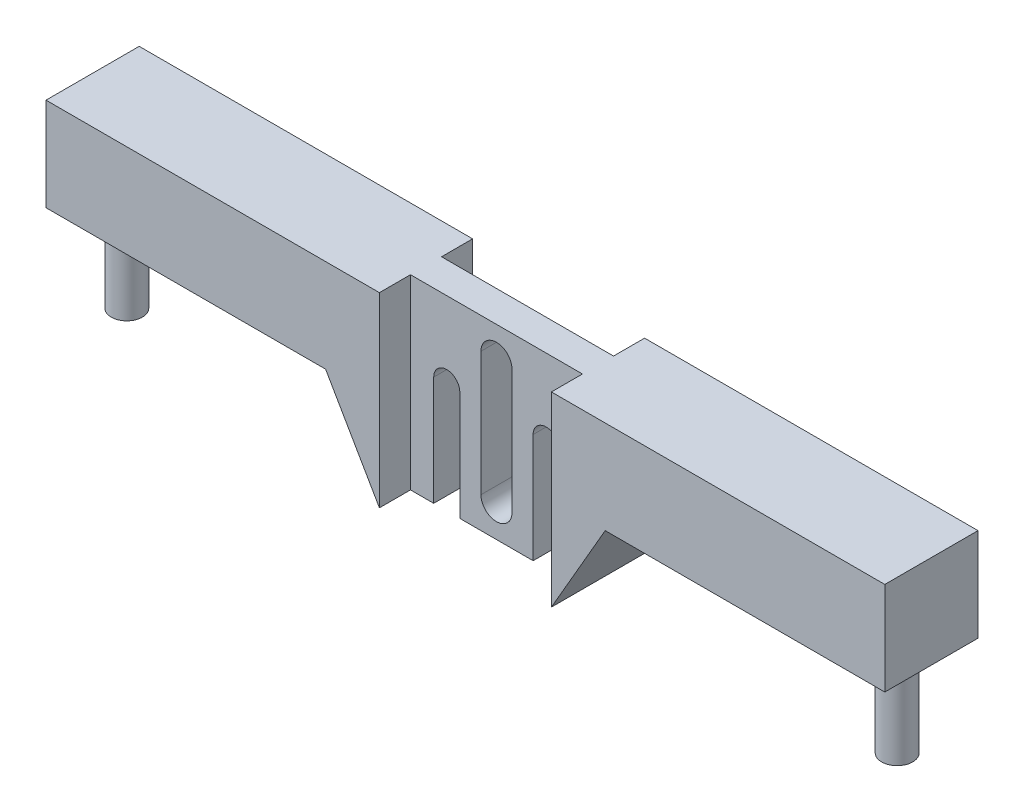
ISO-10303-21;
HEADER;
FILE_DESCRIPTION(('STEP AP214'),'2;1');
FILE_NAME('part.step','',(''),(''),'','','');
FILE_SCHEMA(('AUTOMOTIVE_DESIGN { 1 0 10303 214 1 1 1 1 }'));
ENDSEC;
DATA;
#1=APPLICATION_CONTEXT('core data for automotive mechanical design processes');
#2=APPLICATION_PROTOCOL_DEFINITION('international standard','automotive_design',2000,#1);
#3=PRODUCT_CONTEXT('',#1,'mechanical');
#4=PRODUCT('Part','Part','',(#3));
#5=PRODUCT_RELATED_PRODUCT_CATEGORY('part','',(#4));
#6=PRODUCT_DEFINITION_FORMATION('','',#4);
#7=PRODUCT_DEFINITION_CONTEXT('part definition',#1,'design');
#8=PRODUCT_DEFINITION('design','',#6,#7);
#9=PRODUCT_DEFINITION_SHAPE('','',#8);
#10=(LENGTH_UNIT() NAMED_UNIT(*) SI_UNIT(.MILLI.,.METRE.));
#11=(NAMED_UNIT(*) PLANE_ANGLE_UNIT() SI_UNIT($,.RADIAN.));
#12=(NAMED_UNIT(*) SI_UNIT($,.STERADIAN.) SOLID_ANGLE_UNIT());
#13=UNCERTAINTY_MEASURE_WITH_UNIT(LENGTH_MEASURE(1.E-05),#10,'distance_accuracy_value','');
#14=(GEOMETRIC_REPRESENTATION_CONTEXT(3) GLOBAL_UNCERTAINTY_ASSIGNED_CONTEXT((#13)) GLOBAL_UNIT_ASSIGNED_CONTEXT((#10,
#11,#12)) REPRESENTATION_CONTEXT('',''));
#15=CARTESIAN_POINT('',(0.,0.,0.));
#16=DIRECTION('',(0.,0.,1.));
#17=DIRECTION('',(1.,0.,0.));
#18=AXIS2_PLACEMENT_3D('',#15,#16,#17);
#19=CARTESIAN_POINT('',(0.,0.,7.5));
#20=DIRECTION('',(0.,0.,1.));
#21=DIRECTION('',(1.,0.,0.));
#22=AXIS2_PLACEMENT_3D('',#19,#20,#21);
#23=PLANE('',#22);
#24=DIRECTION('',(0.,-1.,0.));
#25=VECTOR('',#24,1.);
#26=CARTESIAN_POINT('',(13.8397459621557,7.501,7.5));
#27=LINE('',#26,#25);
#28=CARTESIAN_POINT('',(13.8397459621557,7.5,7.5));
#29=VERTEX_POINT('',#28);
#30=CARTESIAN_POINT('',(13.8397459621557,-22.5,7.5));
#31=VERTEX_POINT('',#30);
#32=EDGE_CURVE('E406',#29,#31,#27,.T.);
#33=ORIENTED_EDGE('',*,*,#32,.T.);
#34=DIRECTION('',(-0.499999999999998,-0.86602540378444,0.));
#35=VECTOR('',#34,1.);
#36=CARTESIAN_POINT('',(20.1225952641917,-11.6177857925749,7.5));
#37=LINE('',#36,#35);
#38=CARTESIAN_POINT('',(22.5,-7.5,7.5));
#39=VERTEX_POINT('',#38);
#40=EDGE_CURVE('E288',#39,#31,#37,.T.);
#41=ORIENTED_EDGE('',*,*,#40,.F.);
#42=DIRECTION('',(1.,0.,0.));
#43=VECTOR('',#42,1.);
#44=CARTESIAN_POINT('',(0.,-7.5,7.5));
#45=LINE('',#44,#43);
#46=CARTESIAN_POINT('',(67.5,-7.5,7.5));
#47=VERTEX_POINT('',#46);
#48=EDGE_CURVE('E285',#39,#47,#45,.T.);
#49=ORIENTED_EDGE('',*,*,#48,.T.);
#50=DIRECTION('',(0.,-1.,0.));
#51=VECTOR('',#50,1.);
#52=CARTESIAN_POINT('',(67.5,0.,7.5));
#53=LINE('',#52,#51);
#54=CARTESIAN_POINT('',(67.5,7.5,7.5));
#55=VERTEX_POINT('',#54);
#56=EDGE_CURVE('E272',#55,#47,#53,.T.);
#57=ORIENTED_EDGE('',*,*,#56,.F.);
#58=DIRECTION('',(1.,0.,0.));
#59=VECTOR('',#58,1.);
#60=CARTESIAN_POINT('',(0.,7.5,7.5));
#61=LINE('',#60,#59);
#62=EDGE_CURVE('E275',#29,#55,#61,.T.);
#63=ORIENTED_EDGE('',*,*,#62,.F.);
#64=EDGE_LOOP('',(#33,#41,#49,#57,#63));
#65=FACE_BOUND('',#64,.T.);
#66=ADVANCED_FACE('F36',(#65),#23,.T.);
#67=CARTESIAN_POINT('',(0.,0.,-7.5));
#68=DIRECTION('',(0.,0.,1.));
#69=DIRECTION('',(1.,0.,0.));
#70=AXIS2_PLACEMENT_3D('',#67,#68,#69);
#71=PLANE('',#70);
#72=DIRECTION('',(-0.499999999999998,-0.86602540378444,0.));
#73=VECTOR('',#72,1.);
#74=CARTESIAN_POINT('',(20.1225952641917,-11.6177857925749,-7.5));
#75=LINE('',#74,#73);
#76=CARTESIAN_POINT('',(22.5,-7.5,-7.5));
#77=VERTEX_POINT('',#76);
#78=CARTESIAN_POINT('',(13.8397459621557,-22.5,-7.5));
#79=VERTEX_POINT('',#78);
#80=EDGE_CURVE('E304',#77,#79,#75,.T.);
#81=ORIENTED_EDGE('',*,*,#80,.T.);
#82=DIRECTION('',(0.,-1.,0.));
#83=VECTOR('',#82,1.);
#84=CARTESIAN_POINT('',(13.8397459621557,7.501,-7.5));
#85=LINE('',#84,#83);
#86=CARTESIAN_POINT('',(13.8397459621557,7.5,-7.5));
#87=VERTEX_POINT('',#86);
#88=EDGE_CURVE('E348',#87,#79,#85,.T.);
#89=ORIENTED_EDGE('',*,*,#88,.F.);
#90=DIRECTION('',(1.,0.,0.));
#91=VECTOR('',#90,1.);
#92=CARTESIAN_POINT('',(0.,7.5,-7.5));
#93=LINE('',#92,#91);
#94=CARTESIAN_POINT('',(67.5,7.5,-7.5));
#95=VERTEX_POINT('',#94);
#96=EDGE_CURVE('E293',#87,#95,#93,.T.);
#97=ORIENTED_EDGE('',*,*,#96,.T.);
#98=DIRECTION('',(0.,-1.,0.));
#99=VECTOR('',#98,1.);
#100=CARTESIAN_POINT('',(67.5,0.,-7.5));
#101=LINE('',#100,#99);
#102=CARTESIAN_POINT('',(67.5,-7.5,-7.5));
#103=VERTEX_POINT('',#102);
#104=EDGE_CURVE('E263',#95,#103,#101,.T.);
#105=ORIENTED_EDGE('',*,*,#104,.T.);
#106=DIRECTION('',(1.,0.,0.));
#107=VECTOR('',#106,1.);
#108=CARTESIAN_POINT('',(0.,-7.5,-7.5));
#109=LINE('',#108,#107);
#110=EDGE_CURVE('E276',#77,#103,#109,.T.);
#111=ORIENTED_EDGE('',*,*,#110,.F.);
#112=EDGE_LOOP('',(#81,#89,#97,#105,#111));
#113=FACE_BOUND('',#112,.T.);
#114=ADVANCED_FACE('F446',(#113),#71,.F.);
#115=CARTESIAN_POINT('',(0.,-22.5,7.5));
#116=DIRECTION('',(0.,1.,0.));
#117=DIRECTION('',(0.,0.,1.));
#118=AXIS2_PLACEMENT_3D('',#115,#116,#117);
#119=PLANE('',#118);
#120=DIRECTION('',(0.,0.,-1.));
#121=VECTOR('',#120,1.);
#122=CARTESIAN_POINT('',(5.9,-22.5,-7.501));
#123=LINE('',#122,#121);
#124=CARTESIAN_POINT('',(5.9,-22.5,2.5));
#125=VERTEX_POINT('',#124);
#126=CARTESIAN_POINT('',(5.90000000000001,-22.5,-2.5));
#127=VERTEX_POINT('',#126);
#128=EDGE_CURVE('E227',#125,#127,#123,.T.);
#129=ORIENTED_EDGE('',*,*,#128,.F.);
#130=DIRECTION('',(1.,0.,0.));
#131=VECTOR('',#130,1.);
#132=CARTESIAN_POINT('',(-13.8397459621557,-22.5,2.5));
#133=LINE('',#132,#131);
#134=CARTESIAN_POINT('',(-5.89999999999999,-22.5,2.5));
#135=VERTEX_POINT('',#134);
#136=EDGE_CURVE('E208',#135,#125,#133,.T.);
#137=ORIENTED_EDGE('',*,*,#136,.F.);
#138=DIRECTION('',(0.,0.,1.));
#139=VECTOR('',#138,1.);
#140=CARTESIAN_POINT('',(-5.89999999999999,-22.5,-7.501));
#141=LINE('',#140,#139);
#142=CARTESIAN_POINT('',(-5.89999999999999,-22.5,-2.5));
#143=VERTEX_POINT('',#142);
#144=EDGE_CURVE('E255',#143,#135,#141,.T.);
#145=ORIENTED_EDGE('',*,*,#144,.F.);
#146=DIRECTION('',(-1.,0.,0.));
#147=VECTOR('',#146,1.);
#148=CARTESIAN_POINT('',(13.8397459621557,-22.5,-2.5));
#149=LINE('',#148,#147);
#150=EDGE_CURVE('E234',#127,#143,#149,.T.);
#151=ORIENTED_EDGE('',*,*,#150,.F.);
#152=EDGE_LOOP('',(#129,#137,#145,#151));
#153=FACE_BOUND('',#152,.T.);
#154=ADVANCED_FACE('F233',(#153),#119,.F.);
#155=DIRECTION('',(0.,0.,-1.));
#156=VECTOR('',#155,1.);
#157=CARTESIAN_POINT('',(13.8397459621557,-22.5,7.5));
#158=LINE('',#157,#156);
#159=CARTESIAN_POINT('',(13.8397459621557,-22.5,2.5));
#160=VERTEX_POINT('',#159);
#161=CARTESIAN_POINT('',(13.8397459621557,-22.5,-2.5));
#162=VERTEX_POINT('',#161);
#163=EDGE_CURVE('E311',#160,#162,#158,.T.);
#164=ORIENTED_EDGE('',*,*,#163,.F.);
#165=CARTESIAN_POINT('',(10.1,-22.5,2.5));
#166=VERTEX_POINT('',#165);
#167=EDGE_CURVE('E220',#166,#160,#133,.T.);
#168=ORIENTED_EDGE('',*,*,#167,.F.);
#169=DIRECTION('',(0.,0.,1.));
#170=VECTOR('',#169,1.);
#171=CARTESIAN_POINT('',(10.1,-22.5,-7.501));
#172=LINE('',#171,#170);
#173=CARTESIAN_POINT('',(10.1,-22.5,-2.5));
#174=VERTEX_POINT('',#173);
#175=EDGE_CURVE('E235',#174,#166,#172,.T.);
#176=ORIENTED_EDGE('',*,*,#175,.F.);
#177=EDGE_CURVE('E365',#162,#174,#149,.T.);
#178=ORIENTED_EDGE('',*,*,#177,.F.);
#179=EDGE_LOOP('',(#164,#168,#176,#178));
#180=FACE_BOUND('',#179,.T.);
#181=ADVANCED_FACE('F499',(#180),#119,.F.);
#182=CARTESIAN_POINT('',(67.5,0.,7.5));
#183=DIRECTION('',(1.,0.,0.));
#184=DIRECTION('',(0.,0.,-1.));
#185=AXIS2_PLACEMENT_3D('',#182,#183,#184);
#186=PLANE('',#185);
#187=ORIENTED_EDGE('',*,*,#104,.F.);
#188=DIRECTION('',(0.,0.,-1.));
#189=VECTOR('',#188,1.);
#190=CARTESIAN_POINT('',(67.5,7.5,7.5));
#191=LINE('',#190,#189);
#192=EDGE_CURVE('E11',#55,#95,#191,.T.);
#193=ORIENTED_EDGE('',*,*,#192,.F.);
#194=ORIENTED_EDGE('',*,*,#56,.T.);
#195=DIRECTION('',(0.,0.,-1.));
#196=VECTOR('',#195,1.);
#197=CARTESIAN_POINT('',(67.5,-7.5,7.5));
#198=LINE('',#197,#196);
#199=EDGE_CURVE('E307',#47,#103,#198,.T.);
#200=ORIENTED_EDGE('',*,*,#199,.T.);
#201=EDGE_LOOP('',(#187,#193,#194,#200));
#202=FACE_BOUND('',#201,.T.);
#203=ADVANCED_FACE('F38',(#202),#186,.T.);
#204=CARTESIAN_POINT('',(0.,7.5,7.5));
#205=DIRECTION('',(0.,1.,0.));
#206=DIRECTION('',(0.,0.,1.));
#207=AXIS2_PLACEMENT_3D('',#204,#205,#206);
#208=PLANE('',#207);
#209=DIRECTION('',(0.,0.,1.));
#210=VECTOR('',#209,1.);
#211=CARTESIAN_POINT('',(13.8397459621557,7.5,2.5));
#212=LINE('',#211,#210);
#213=CARTESIAN_POINT('',(13.8397459621557,7.5,2.5));
#214=VERTEX_POINT('',#213);
#215=EDGE_CURVE('E415',#214,#29,#212,.T.);
#216=ORIENTED_EDGE('',*,*,#215,.T.);
#217=ORIENTED_EDGE('',*,*,#62,.T.);
#218=ORIENTED_EDGE('',*,*,#192,.T.);
#219=ORIENTED_EDGE('',*,*,#96,.F.);
#220=DIRECTION('',(0.,0.,1.));
#221=VECTOR('',#220,1.);
#222=CARTESIAN_POINT('',(13.8397459621557,7.5,-7.5));
#223=LINE('',#222,#221);
#224=CARTESIAN_POINT('',(13.8397459621557,7.5,-2.5));
#225=VERTEX_POINT('',#224);
#226=EDGE_CURVE('E381',#87,#225,#223,.T.);
#227=ORIENTED_EDGE('',*,*,#226,.T.);
#228=DIRECTION('',(-1.,0.,0.));
#229=VECTOR('',#228,1.);
#230=CARTESIAN_POINT('',(13.8397459621557,7.5,-2.5));
#231=LINE('',#230,#229);
#232=CARTESIAN_POINT('',(-13.8397459621557,7.5,-2.5));
#233=VERTEX_POINT('',#232);
#234=EDGE_CURVE('E342',#225,#233,#231,.T.);
#235=ORIENTED_EDGE('',*,*,#234,.T.);
#236=DIRECTION('',(0.,0.,-1.));
#237=VECTOR('',#236,1.);
#238=CARTESIAN_POINT('',(-13.8397459621557,7.5,-2.5));
#239=LINE('',#238,#237);
#240=CARTESIAN_POINT('',(-13.8397459621557,7.5,-7.5));
#241=VERTEX_POINT('',#240);
#242=EDGE_CURVE('E244',#233,#241,#239,.T.);
#243=ORIENTED_EDGE('',*,*,#242,.T.);
#244=CARTESIAN_POINT('',(-67.5,7.5,-7.5));
#245=VERTEX_POINT('',#244);
#246=EDGE_CURVE('E294',#245,#241,#93,.T.);
#247=ORIENTED_EDGE('',*,*,#246,.F.);
#248=DIRECTION('',(0.,0.,-1.));
#249=VECTOR('',#248,1.);
#250=CARTESIAN_POINT('',(-67.5,7.5,7.5));
#251=LINE('',#250,#249);
#252=CARTESIAN_POINT('',(-67.5,7.5,7.5));
#253=VERTEX_POINT('',#252);
#254=EDGE_CURVE('E44',#253,#245,#251,.T.);
#255=ORIENTED_EDGE('',*,*,#254,.F.);
#256=CARTESIAN_POINT('',(-13.8397459621557,7.5,7.5));
#257=VERTEX_POINT('',#256);
#258=EDGE_CURVE('E277',#253,#257,#61,.T.);
#259=ORIENTED_EDGE('',*,*,#258,.T.);
#260=DIRECTION('',(0.,0.,-1.));
#261=VECTOR('',#260,1.);
#262=CARTESIAN_POINT('',(-13.8397459621557,7.5,7.5));
#263=LINE('',#262,#261);
#264=CARTESIAN_POINT('',(-13.8397459621557,7.5,2.5));
#265=VERTEX_POINT('',#264);
#266=EDGE_CURVE('E403',#257,#265,#263,.T.);
#267=ORIENTED_EDGE('',*,*,#266,.T.);
#268=DIRECTION('',(1.,0.,0.));
#269=VECTOR('',#268,1.);
#270=CARTESIAN_POINT('',(-13.8397459621557,7.5,2.5));
#271=LINE('',#270,#269);
#272=EDGE_CURVE('E417',#265,#214,#271,.T.);
#273=ORIENTED_EDGE('',*,*,#272,.T.);
#274=EDGE_LOOP('',(#216,#217,#218,#219,#227,#235,#243,#247,#255,#259,#267,#273));
#275=FACE_BOUND('',#274,.T.);
#276=ADVANCED_FACE('F339',(#275),#208,.T.);
#277=CARTESIAN_POINT('',(-67.5,0.,7.5));
#278=DIRECTION('',(1.,0.,0.));
#279=DIRECTION('',(0.,0.,-1.));
#280=AXIS2_PLACEMENT_3D('',#277,#278,#279);
#281=PLANE('',#280);
#282=DIRECTION('',(0.,-1.,0.));
#283=VECTOR('',#282,1.);
#284=CARTESIAN_POINT('',(-67.5,0.,-7.5));
#285=LINE('',#284,#283);
#286=CARTESIAN_POINT('',(-67.5,-7.5,-7.5));
#287=VERTEX_POINT('',#286);
#288=EDGE_CURVE('E297',#245,#287,#285,.T.);
#289=ORIENTED_EDGE('',*,*,#288,.T.);
#290=DIRECTION('',(0.,0.,-1.));
#291=VECTOR('',#290,1.);
#292=CARTESIAN_POINT('',(-67.5,-7.5,7.5));
#293=LINE('',#292,#291);
#294=CARTESIAN_POINT('',(-67.5,-7.5,7.5));
#295=VERTEX_POINT('',#294);
#296=EDGE_CURVE('E322',#295,#287,#293,.T.);
#297=ORIENTED_EDGE('',*,*,#296,.F.);
#298=DIRECTION('',(0.,-1.,0.));
#299=VECTOR('',#298,1.);
#300=CARTESIAN_POINT('',(-67.5,0.,7.5));
#301=LINE('',#300,#299);
#302=EDGE_CURVE('E280',#253,#295,#301,.T.);
#303=ORIENTED_EDGE('',*,*,#302,.F.);
#304=ORIENTED_EDGE('',*,*,#254,.T.);
#305=EDGE_LOOP('',(#289,#297,#303,#304));
#306=FACE_BOUND('',#305,.T.);
#307=ADVANCED_FACE('F327',(#306),#281,.F.);
#308=CARTESIAN_POINT('',(0.,-7.5,7.5));
#309=DIRECTION('',(0.,1.,0.));
#310=DIRECTION('',(0.,0.,1.));
#311=AXIS2_PLACEMENT_3D('',#308,#309,#310);
#312=PLANE('',#311);
#313=CARTESIAN_POINT('',(-61.994193156132,-7.5,0.));
#314=DIRECTION('',(0.,1.,0.));
#315=DIRECTION('',(0.,0.,1.));
#316=AXIS2_PLACEMENT_3D('',#313,#314,#315);
#317=CIRCLE('',#316,2.5);
#318=CARTESIAN_POINT('',(-61.994193156132,-7.5,2.50000000000001));
#319=VERTEX_POINT('',#318);
#320=EDGE_CURVE('E422',#319,#319,#317,.T.);
#321=ORIENTED_EDGE('',*,*,#320,.T.);
#322=EDGE_LOOP('',(#321));
#323=FACE_BOUND('',#322,.T.);
#324=CARTESIAN_POINT('',(-22.5,-7.5,-7.5));
#325=VERTEX_POINT('',#324);
#326=EDGE_CURVE('E299',#287,#325,#109,.T.);
#327=ORIENTED_EDGE('',*,*,#326,.T.);
#328=DIRECTION('',(0.,0.,-1.));
#329=VECTOR('',#328,1.);
#330=CARTESIAN_POINT('',(-22.5,-7.5,7.5));
#331=LINE('',#330,#329);
#332=CARTESIAN_POINT('',(-22.5,-7.5,7.5));
#333=VERTEX_POINT('',#332);
#334=EDGE_CURVE('E319',#333,#325,#331,.T.);
#335=ORIENTED_EDGE('',*,*,#334,.F.);
#336=EDGE_CURVE('E282',#295,#333,#45,.T.);
#337=ORIENTED_EDGE('',*,*,#336,.F.);
#338=ORIENTED_EDGE('',*,*,#296,.T.);
#339=EDGE_LOOP('',(#327,#335,#337,#338));
#340=FACE_BOUND('',#339,.T.);
#341=ADVANCED_FACE('F467',(#323,#340),#312,.F.);
#342=CARTESIAN_POINT('',(-20.1225952641917,-11.6177857925749,7.5));
#343=DIRECTION('',(0.86602540378444,0.499999999999998,0.));
#344=DIRECTION('',(-0.499999999999998,0.86602540378444,0.));
#345=AXIS2_PLACEMENT_3D('',#342,#343,#344);
#346=PLANE('',#345);
#347=DIRECTION('',(0.499999999999998,-0.86602540378444,0.));
#348=VECTOR('',#347,1.);
#349=CARTESIAN_POINT('',(-20.1225952641917,-11.6177857925749,-7.5));
#350=LINE('',#349,#348);
#351=CARTESIAN_POINT('',(-13.8397459621557,-22.5,-7.5));
#352=VERTEX_POINT('',#351);
#353=EDGE_CURVE('E301',#325,#352,#350,.T.);
#354=ORIENTED_EDGE('',*,*,#353,.T.);
#355=DIRECTION('',(0.,0.,-1.));
#356=VECTOR('',#355,1.);
#357=CARTESIAN_POINT('',(-13.8397459621557,-22.5,-2.5));
#358=LINE('',#357,#356);
#359=CARTESIAN_POINT('',(-13.8397459621557,-22.5,-2.5));
#360=VERTEX_POINT('',#359);
#361=EDGE_CURVE('E361',#360,#352,#358,.T.);
#362=ORIENTED_EDGE('',*,*,#361,.F.);
#363=DIRECTION('',(0.,0.,-1.));
#364=VECTOR('',#363,1.);
#365=CARTESIAN_POINT('',(-13.8397459621557,-22.5,7.5));
#366=LINE('',#365,#364);
#367=CARTESIAN_POINT('',(-13.8397459621557,-22.5,2.5));
#368=VERTEX_POINT('',#367);
#369=EDGE_CURVE('E315',#368,#360,#366,.T.);
#370=ORIENTED_EDGE('',*,*,#369,.F.);
#371=CARTESIAN_POINT('',(-13.8397459621557,-22.5,7.5));
#372=VERTEX_POINT('',#371);
#373=EDGE_CURVE('E316',#372,#368,#366,.T.);
#374=ORIENTED_EDGE('',*,*,#373,.F.);
#375=DIRECTION('',(0.499999999999998,-0.86602540378444,0.));
#376=VECTOR('',#375,1.);
#377=CARTESIAN_POINT('',(-20.1225952641917,-11.6177857925749,7.5));
#378=LINE('',#377,#376);
#379=EDGE_CURVE('E284',#333,#372,#378,.T.);
#380=ORIENTED_EDGE('',*,*,#379,.F.);
#381=ORIENTED_EDGE('',*,*,#334,.T.);
#382=EDGE_LOOP('',(#354,#362,#370,#374,#380,#381));
#383=FACE_BOUND('',#382,.T.);
#384=ADVANCED_FACE('F528',(#383),#346,.F.);
#385=DIRECTION('',(0.,0.,-1.));
#386=VECTOR('',#385,1.);
#387=CARTESIAN_POINT('',(-10.1,-22.5,-7.501));
#388=LINE('',#387,#386);
#389=CARTESIAN_POINT('',(-10.1,-22.5,2.5));
#390=VERTEX_POINT('',#389);
#391=CARTESIAN_POINT('',(-10.1,-22.5,-2.5));
#392=VERTEX_POINT('',#391);
#393=EDGE_CURVE('E252',#390,#392,#388,.T.);
#394=ORIENTED_EDGE('',*,*,#393,.F.);
#395=EDGE_CURVE('E219',#368,#390,#133,.T.);
#396=ORIENTED_EDGE('',*,*,#395,.F.);
#397=ORIENTED_EDGE('',*,*,#369,.T.);
#398=EDGE_CURVE('E368',#392,#360,#149,.T.);
#399=ORIENTED_EDGE('',*,*,#398,.F.);
#400=EDGE_LOOP('',(#394,#396,#397,#399));
#401=FACE_BOUND('',#400,.T.);
#402=ADVANCED_FACE('F524',(#401),#119,.F.);
#403=CARTESIAN_POINT('',(20.1225952641917,-11.6177857925749,7.5));
#404=DIRECTION('',(0.86602540378444,-0.499999999999998,0.));
#405=DIRECTION('',(0.499999999999998,0.86602540378444,0.));
#406=AXIS2_PLACEMENT_3D('',#403,#404,#405);
#407=PLANE('',#406);
#408=ORIENTED_EDGE('',*,*,#80,.F.);
#409=DIRECTION('',(0.,0.,-1.));
#410=VECTOR('',#409,1.);
#411=CARTESIAN_POINT('',(22.5,-7.5,7.5));
#412=LINE('',#411,#410);
#413=EDGE_CURVE('E309',#39,#77,#412,.T.);
#414=ORIENTED_EDGE('',*,*,#413,.F.);
#415=ORIENTED_EDGE('',*,*,#40,.T.);
#416=EDGE_CURVE('E312',#31,#160,#158,.T.);
#417=ORIENTED_EDGE('',*,*,#416,.T.);
#418=ORIENTED_EDGE('',*,*,#163,.T.);
#419=DIRECTION('',(0.,0.,1.));
#420=VECTOR('',#419,1.);
#421=CARTESIAN_POINT('',(13.8397459621557,-22.5,-7.5));
#422=LINE('',#421,#420);
#423=EDGE_CURVE('E356',#79,#162,#422,.T.);
#424=ORIENTED_EDGE('',*,*,#423,.F.);
#425=EDGE_LOOP('',(#408,#414,#415,#417,#418,#424));
#426=FACE_BOUND('',#425,.T.);
#427=ADVANCED_FACE('F464',(#426),#407,.T.);
#428=CARTESIAN_POINT('',(61.994193156132,-7.5,0.));
#429=DIRECTION('',(0.,1.,0.));
#430=DIRECTION('',(0.,0.,1.));
#431=AXIS2_PLACEMENT_3D('',#428,#429,#430);
#432=CIRCLE('',#431,2.5);
#433=CARTESIAN_POINT('',(61.994193156132,-7.5,2.5));
#434=VERTEX_POINT('',#433);
#435=EDGE_CURVE('E428',#434,#434,#432,.T.);
#436=ORIENTED_EDGE('',*,*,#435,.T.);
#437=EDGE_LOOP('',(#436));
#438=FACE_BOUND('',#437,.T.);
#439=ORIENTED_EDGE('',*,*,#110,.T.);
#440=ORIENTED_EDGE('',*,*,#199,.F.);
#441=ORIENTED_EDGE('',*,*,#48,.F.);
#442=ORIENTED_EDGE('',*,*,#413,.T.);
#443=EDGE_LOOP('',(#439,#440,#441,#442));
#444=FACE_BOUND('',#443,.T.);
#445=ADVANCED_FACE('F457',(#438,#444),#312,.F.);
#446=DIRECTION('',(0.,-1.,0.));
#447=VECTOR('',#446,1.);
#448=CARTESIAN_POINT('',(-13.8397459621557,7.501,7.5));
#449=LINE('',#448,#447);
#450=EDGE_CURVE('E407',#257,#372,#449,.T.);
#451=ORIENTED_EDGE('',*,*,#450,.F.);
#452=ORIENTED_EDGE('',*,*,#258,.F.);
#453=ORIENTED_EDGE('',*,*,#302,.T.);
#454=ORIENTED_EDGE('',*,*,#336,.T.);
#455=ORIENTED_EDGE('',*,*,#379,.T.);
#456=EDGE_LOOP('',(#451,#452,#453,#454,#455));
#457=FACE_BOUND('',#456,.T.);
#458=ADVANCED_FACE('F449',(#457),#23,.T.);
#459=ORIENTED_EDGE('',*,*,#246,.T.);
#460=DIRECTION('',(0.,-1.,0.));
#461=VECTOR('',#460,1.);
#462=CARTESIAN_POINT('',(-13.8397459621557,7.501,-7.5));
#463=LINE('',#462,#461);
#464=EDGE_CURVE('E353',#241,#352,#463,.T.);
#465=ORIENTED_EDGE('',*,*,#464,.T.);
#466=ORIENTED_EDGE('',*,*,#353,.F.);
#467=ORIENTED_EDGE('',*,*,#326,.F.);
#468=ORIENTED_EDGE('',*,*,#288,.F.);
#469=EDGE_LOOP('',(#459,#465,#466,#467,#468));
#470=FACE_BOUND('',#469,.T.);
#471=ADVANCED_FACE('F334',(#470),#71,.F.);
#472=CARTESIAN_POINT('',(8.,-4.90363532889916,-7.501));
#473=DIRECTION('',(0.,0.,1.));
#474=DIRECTION('',(1.,0.,0.));
#475=AXIS2_PLACEMENT_3D('',#472,#473,#474);
#476=CYLINDRICAL_SURFACE('',#475,2.1);
#477=DIRECTION('',(0.,0.,1.));
#478=VECTOR('',#477,1.);
#479=CARTESIAN_POINT('',(10.1,-4.90363532889916,-7.501));
#480=LINE('',#479,#478);
#481=CARTESIAN_POINT('',(10.1,-4.90363532889916,-2.5));
#482=VERTEX_POINT('',#481);
#483=CARTESIAN_POINT('',(10.1,-4.90363532889916,2.5));
#484=VERTEX_POINT('',#483);
#485=EDGE_CURVE('E247',#482,#484,#480,.T.);
#486=ORIENTED_EDGE('',*,*,#485,.T.);
#487=CARTESIAN_POINT('',(8.,-4.90363532889916,2.5));
#488=DIRECTION('',(0.,0.,-1.));
#489=DIRECTION('',(-1.,0.,0.));
#490=AXIS2_PLACEMENT_3D('',#487,#488,#489);
#491=CIRCLE('',#490,2.1);
#492=CARTESIAN_POINT('',(5.9,-4.90363532889916,2.5));
#493=VERTEX_POINT('',#492);
#494=EDGE_CURVE('E399',#493,#484,#491,.T.);
#495=ORIENTED_EDGE('',*,*,#494,.F.);
#496=DIRECTION('',(0.,0.,1.));
#497=VECTOR('',#496,1.);
#498=CARTESIAN_POINT('',(5.9,-4.90363532889916,-7.501));
#499=LINE('',#498,#497);
#500=CARTESIAN_POINT('',(5.9,-4.90363532889916,-2.5));
#501=VERTEX_POINT('',#500);
#502=EDGE_CURVE('E229',#501,#493,#499,.T.);
#503=ORIENTED_EDGE('',*,*,#502,.F.);
#504=CARTESIAN_POINT('',(8.,-4.90363532889916,-2.5));
#505=DIRECTION('',(0.,0.,1.));
#506=DIRECTION('',(1.,0.,0.));
#507=AXIS2_PLACEMENT_3D('',#504,#505,#506);
#508=CIRCLE('',#507,2.1);
#509=EDGE_CURVE('E377',#482,#501,#508,.T.);
#510=ORIENTED_EDGE('',*,*,#509,.F.);
#511=EDGE_LOOP('',(#486,#495,#503,#510));
#512=FACE_BOUND('',#511,.T.);
#513=ADVANCED_FACE('F463',(#512),#476,.F.);
#514=CARTESIAN_POINT('',(10.1,-4.90363532889916,-7.501));
#515=DIRECTION('',(1.,0.,0.));
#516=DIRECTION('',(0.,1.,0.));
#517=AXIS2_PLACEMENT_3D('',#514,#515,#516);
#518=PLANE('',#517);
#519=ORIENTED_EDGE('',*,*,#175,.T.);
#520=DIRECTION('',(0.,-1.,0.));
#521=VECTOR('',#520,1.);
#522=CARTESIAN_POINT('',(10.1,7.501,2.5));
#523=LINE('',#522,#521);
#524=EDGE_CURVE('E230',#484,#166,#523,.T.);
#525=ORIENTED_EDGE('',*,*,#524,.F.);
#526=ORIENTED_EDGE('',*,*,#485,.F.);
#527=DIRECTION('',(0.,1.,0.));
#528=VECTOR('',#527,1.);
#529=CARTESIAN_POINT('',(10.1,7.501,-2.5));
#530=LINE('',#529,#528);
#531=EDGE_CURVE('E384',#174,#482,#530,.T.);
#532=ORIENTED_EDGE('',*,*,#531,.F.);
#533=EDGE_LOOP('',(#519,#525,#526,#532));
#534=FACE_BOUND('',#533,.T.);
#535=ADVANCED_FACE('F506',(#534),#518,.F.);
#536=CARTESIAN_POINT('',(5.9,-4.90363532889916,-7.501));
#537=DIRECTION('',(-1.,0.,0.));
#538=DIRECTION('',(0.,-1.,0.));
#539=AXIS2_PLACEMENT_3D('',#536,#537,#538);
#540=PLANE('',#539);
#541=ORIENTED_EDGE('',*,*,#502,.T.);
#542=DIRECTION('',(0.,1.,0.));
#543=VECTOR('',#542,1.);
#544=CARTESIAN_POINT('',(5.9,7.501,2.5));
#545=LINE('',#544,#543);
#546=EDGE_CURVE('E211',#125,#493,#545,.T.);
#547=ORIENTED_EDGE('',*,*,#546,.F.);
#548=ORIENTED_EDGE('',*,*,#128,.T.);
#549=DIRECTION('',(0.,-1.,0.));
#550=VECTOR('',#549,1.);
#551=CARTESIAN_POINT('',(5.9,7.501,-2.5));
#552=LINE('',#551,#550);
#553=EDGE_CURVE('E386',#501,#127,#552,.T.);
#554=ORIENTED_EDGE('',*,*,#553,.F.);
#555=EDGE_LOOP('',(#541,#547,#548,#554));
#556=FACE_BOUND('',#555,.T.);
#557=ADVANCED_FACE('F225',(#556),#540,.F.);
#558=CARTESIAN_POINT('',(-8.,-4.90363532889916,-7.501));
#559=DIRECTION('',(0.,0.,1.));
#560=DIRECTION('',(1.,0.,0.));
#561=AXIS2_PLACEMENT_3D('',#558,#559,#560);
#562=CYLINDRICAL_SURFACE('',#561,2.1);
#563=DIRECTION('',(0.,0.,1.));
#564=VECTOR('',#563,1.);
#565=CARTESIAN_POINT('',(-5.9,-4.90363532889916,-7.501));
#566=LINE('',#565,#564);
#567=CARTESIAN_POINT('',(-5.9,-4.90363532889916,-2.5));
#568=VERTEX_POINT('',#567);
#569=CARTESIAN_POINT('',(-5.9,-4.90363532889916,2.5));
#570=VERTEX_POINT('',#569);
#571=EDGE_CURVE('E236',#568,#570,#566,.T.);
#572=ORIENTED_EDGE('',*,*,#571,.T.);
#573=CARTESIAN_POINT('',(-8.,-4.90363532889916,2.5));
#574=DIRECTION('',(0.,0.,-1.));
#575=DIRECTION('',(-1.,0.,0.));
#576=AXIS2_PLACEMENT_3D('',#573,#574,#575);
#577=CIRCLE('',#576,2.1);
#578=CARTESIAN_POINT('',(-10.1,-4.90363532889916,2.5));
#579=VERTEX_POINT('',#578);
#580=EDGE_CURVE('E401',#579,#570,#577,.T.);
#581=ORIENTED_EDGE('',*,*,#580,.F.);
#582=DIRECTION('',(0.,0.,1.));
#583=VECTOR('',#582,1.);
#584=CARTESIAN_POINT('',(-10.1,-4.90363532889916,-7.501));
#585=LINE('',#584,#583);
#586=CARTESIAN_POINT('',(-10.1,-4.90363532889916,-2.5));
#587=VERTEX_POINT('',#586);
#588=EDGE_CURVE('E241',#587,#579,#585,.T.);
#589=ORIENTED_EDGE('',*,*,#588,.F.);
#590=CARTESIAN_POINT('',(-8.,-4.90363532889916,-2.5));
#591=DIRECTION('',(0.,0.,1.));
#592=DIRECTION('',(1.,0.,0.));
#593=AXIS2_PLACEMENT_3D('',#590,#591,#592);
#594=CIRCLE('',#593,2.1);
#595=EDGE_CURVE('E379',#568,#587,#594,.T.);
#596=ORIENTED_EDGE('',*,*,#595,.F.);
#597=EDGE_LOOP('',(#572,#581,#589,#596));
#598=FACE_BOUND('',#597,.T.);
#599=ADVANCED_FACE('F516',(#598),#562,.F.);
#600=CARTESIAN_POINT('',(-5.9,-4.90363532889916,-7.501));
#601=DIRECTION('',(1.,0.,0.));
#602=DIRECTION('',(0.,1.,0.));
#603=AXIS2_PLACEMENT_3D('',#600,#601,#602);
#604=PLANE('',#603);
#605=ORIENTED_EDGE('',*,*,#144,.T.);
#606=DIRECTION('',(0.,-1.,0.));
#607=VECTOR('',#606,1.);
#608=CARTESIAN_POINT('',(-5.9,7.501,2.5));
#609=LINE('',#608,#607);
#610=EDGE_CURVE('E214',#570,#135,#609,.T.);
#611=ORIENTED_EDGE('',*,*,#610,.F.);
#612=ORIENTED_EDGE('',*,*,#571,.F.);
#613=DIRECTION('',(0.,1.,0.));
#614=VECTOR('',#613,1.);
#615=CARTESIAN_POINT('',(-5.9,7.501,-2.5));
#616=LINE('',#615,#614);
#617=EDGE_CURVE('E388',#143,#568,#616,.T.);
#618=ORIENTED_EDGE('',*,*,#617,.F.);
#619=EDGE_LOOP('',(#605,#611,#612,#618));
#620=FACE_BOUND('',#619,.T.);
#621=ADVANCED_FACE('F513',(#620),#604,.F.);
#622=CARTESIAN_POINT('',(-10.1,-4.90363532889916,-7.501));
#623=DIRECTION('',(-1.,0.,0.));
#624=DIRECTION('',(0.,0.,1.));
#625=AXIS2_PLACEMENT_3D('',#622,#623,#624);
#626=PLANE('',#625);
#627=ORIENTED_EDGE('',*,*,#588,.T.);
#628=DIRECTION('',(0.,1.,0.));
#629=VECTOR('',#628,1.);
#630=CARTESIAN_POINT('',(-10.1,7.501,2.5));
#631=LINE('',#630,#629);
#632=EDGE_CURVE('E345',#390,#579,#631,.T.);
#633=ORIENTED_EDGE('',*,*,#632,.F.);
#634=ORIENTED_EDGE('',*,*,#393,.T.);
#635=DIRECTION('',(0.,-1.,0.));
#636=VECTOR('',#635,1.);
#637=CARTESIAN_POINT('',(-10.1,7.501,-2.5));
#638=LINE('',#637,#636);
#639=EDGE_CURVE('E390',#587,#392,#638,.T.);
#640=ORIENTED_EDGE('',*,*,#639,.F.);
#641=EDGE_LOOP('',(#627,#633,#634,#640));
#642=FACE_BOUND('',#641,.T.);
#643=ADVANCED_FACE('F521',(#642),#626,.F.);
#644=CARTESIAN_POINT('',(13.8397459621557,7.501,-2.5));
#645=DIRECTION('',(0.,0.,1.));
#646=DIRECTION('',(1.,0.,0.));
#647=AXIS2_PLACEMENT_3D('',#644,#645,#646);
#648=PLANE('',#647);
#649=DIRECTION('',(0.,-1.,0.));
#650=VECTOR('',#649,1.);
#651=CARTESIAN_POINT('',(13.8397459621557,7.501,-2.5));
#652=LINE('',#651,#650);
#653=EDGE_CURVE('E346',#225,#162,#652,.T.);
#654=ORIENTED_EDGE('',*,*,#653,.T.);
#655=ORIENTED_EDGE('',*,*,#177,.T.);
#656=ORIENTED_EDGE('',*,*,#531,.T.);
#657=ORIENTED_EDGE('',*,*,#509,.T.);
#658=ORIENTED_EDGE('',*,*,#553,.T.);
#659=ORIENTED_EDGE('',*,*,#150,.T.);
#660=ORIENTED_EDGE('',*,*,#617,.T.);
#661=ORIENTED_EDGE('',*,*,#595,.T.);
#662=ORIENTED_EDGE('',*,*,#639,.T.);
#663=ORIENTED_EDGE('',*,*,#398,.T.);
#664=DIRECTION('',(0.,-1.,0.));
#665=VECTOR('',#664,1.);
#666=CARTESIAN_POINT('',(-13.8397459621557,7.501,-2.5));
#667=LINE('',#666,#665);
#668=EDGE_CURVE('E359',#233,#360,#667,.T.);
#669=ORIENTED_EDGE('',*,*,#668,.F.);
#670=ORIENTED_EDGE('',*,*,#234,.F.);
#671=EDGE_LOOP('',(#654,#655,#656,#657,#658,#659,#660,#661,#662,#663,#669,#670));
#672=FACE_BOUND('',#671,.T.);
#673=CARTESIAN_POINT('',(0.,2.5,-2.5));
#674=DIRECTION('',(0.,0.,1.));
#675=DIRECTION('',(1.,0.,0.));
#676=AXIS2_PLACEMENT_3D('',#673,#674,#675);
#677=CIRCLE('',#676,2.5);
#678=CARTESIAN_POINT('',(2.5,2.5,-2.5));
#679=VERTEX_POINT('',#678);
#680=CARTESIAN_POINT('',(-2.5,2.5,-2.5));
#681=VERTEX_POINT('',#680);
#682=EDGE_CURVE('E59',#679,#681,#677,.T.);
#683=ORIENTED_EDGE('',*,*,#682,.T.);
#684=DIRECTION('',(0.,-1.,0.));
#685=VECTOR('',#684,1.);
#686=CARTESIAN_POINT('',(-2.5,7.501,-2.5));
#687=LINE('',#686,#685);
#688=CARTESIAN_POINT('',(-2.5,-17.5,-2.5));
#689=VERTEX_POINT('',#688);
#690=EDGE_CURVE('E375',#681,#689,#687,.T.);
#691=ORIENTED_EDGE('',*,*,#690,.T.);
#692=CARTESIAN_POINT('',(0.,-17.5,-2.5));
#693=DIRECTION('',(0.,0.,1.));
#694=DIRECTION('',(1.,0.,0.));
#695=AXIS2_PLACEMENT_3D('',#692,#693,#694);
#696=CIRCLE('',#695,2.5);
#697=CARTESIAN_POINT('',(2.5,-17.5,-2.5));
#698=VERTEX_POINT('',#697);
#699=EDGE_CURVE('E373',#689,#698,#696,.T.);
#700=ORIENTED_EDGE('',*,*,#699,.T.);
#701=DIRECTION('',(0.,1.,0.));
#702=VECTOR('',#701,1.);
#703=CARTESIAN_POINT('',(2.5,7.501,-2.5));
#704=LINE('',#703,#702);
#705=EDGE_CURVE('E371',#698,#679,#704,.T.);
#706=ORIENTED_EDGE('',*,*,#705,.T.);
#707=EDGE_LOOP('',(#683,#691,#700,#706));
#708=FACE_BOUND('',#707,.T.);
#709=ADVANCED_FACE('F502',(#672,#708),#648,.F.);
#710=CARTESIAN_POINT('',(13.8397459621557,7.501,-7.5));
#711=DIRECTION('',(1.,0.,0.));
#712=DIRECTION('',(0.,0.,-1.));
#713=AXIS2_PLACEMENT_3D('',#710,#711,#712);
#714=PLANE('',#713);
#715=ORIENTED_EDGE('',*,*,#88,.T.);
#716=ORIENTED_EDGE('',*,*,#423,.T.);
#717=ORIENTED_EDGE('',*,*,#653,.F.);
#718=ORIENTED_EDGE('',*,*,#226,.F.);
#719=EDGE_LOOP('',(#715,#716,#717,#718));
#720=FACE_BOUND('',#719,.T.);
#721=ADVANCED_FACE('F495',(#720),#714,.F.);
#722=CARTESIAN_POINT('',(-13.8397459621557,7.501,-2.5));
#723=DIRECTION('',(-1.,0.,0.));
#724=DIRECTION('',(0.,0.,1.));
#725=AXIS2_PLACEMENT_3D('',#722,#723,#724);
#726=PLANE('',#725);
#727=ORIENTED_EDGE('',*,*,#668,.T.);
#728=ORIENTED_EDGE('',*,*,#361,.T.);
#729=ORIENTED_EDGE('',*,*,#464,.F.);
#730=ORIENTED_EDGE('',*,*,#242,.F.);
#731=EDGE_LOOP('',(#727,#728,#729,#730));
#732=FACE_BOUND('',#731,.T.);
#733=ADVANCED_FACE('F530',(#732),#726,.F.);
#734=CARTESIAN_POINT('',(-13.8397459621557,7.501,2.5));
#735=DIRECTION('',(0.,0.,-1.));
#736=DIRECTION('',(-1.,0.,0.));
#737=AXIS2_PLACEMENT_3D('',#734,#735,#736);
#738=PLANE('',#737);
#739=DIRECTION('',(0.,-1.,0.));
#740=VECTOR('',#739,1.);
#741=CARTESIAN_POINT('',(-13.8397459621557,7.501,2.5));
#742=LINE('',#741,#740);
#743=EDGE_CURVE('E409',#265,#368,#742,.T.);
#744=ORIENTED_EDGE('',*,*,#743,.T.);
#745=ORIENTED_EDGE('',*,*,#395,.T.);
#746=ORIENTED_EDGE('',*,*,#632,.T.);
#747=ORIENTED_EDGE('',*,*,#580,.T.);
#748=ORIENTED_EDGE('',*,*,#610,.T.);
#749=ORIENTED_EDGE('',*,*,#136,.T.);
#750=ORIENTED_EDGE('',*,*,#546,.T.);
#751=ORIENTED_EDGE('',*,*,#494,.T.);
#752=ORIENTED_EDGE('',*,*,#524,.T.);
#753=ORIENTED_EDGE('',*,*,#167,.T.);
#754=DIRECTION('',(0.,-1.,0.));
#755=VECTOR('',#754,1.);
#756=CARTESIAN_POINT('',(13.8397459621557,7.501,2.5));
#757=LINE('',#756,#755);
#758=EDGE_CURVE('E411',#214,#160,#757,.T.);
#759=ORIENTED_EDGE('',*,*,#758,.F.);
#760=ORIENTED_EDGE('',*,*,#272,.F.);
#761=EDGE_LOOP('',(#744,#745,#746,#747,#748,#749,#750,#751,#752,#753,#759,#760));
#762=FACE_BOUND('',#761,.T.);
#763=CARTESIAN_POINT('',(0.,2.5,2.5));
#764=DIRECTION('',(0.,0.,-1.));
#765=DIRECTION('',(-1.,0.,0.));
#766=AXIS2_PLACEMENT_3D('',#763,#764,#765);
#767=CIRCLE('',#766,2.5);
#768=CARTESIAN_POINT('',(-2.5,2.5,2.5));
#769=VERTEX_POINT('',#768);
#770=CARTESIAN_POINT('',(2.5,2.5,2.5));
#771=VERTEX_POINT('',#770);
#772=EDGE_CURVE('E256',#769,#771,#767,.T.);
#773=ORIENTED_EDGE('',*,*,#772,.T.);
#774=DIRECTION('',(0.,-1.,0.));
#775=VECTOR('',#774,1.);
#776=CARTESIAN_POINT('',(2.5,7.501,2.5));
#777=LINE('',#776,#775);
#778=CARTESIAN_POINT('',(2.5,-17.5,2.5));
#779=VERTEX_POINT('',#778);
#780=EDGE_CURVE('E394',#771,#779,#777,.T.);
#781=ORIENTED_EDGE('',*,*,#780,.T.);
#782=CARTESIAN_POINT('',(0.,-17.5,2.5));
#783=DIRECTION('',(0.,0.,-1.));
#784=DIRECTION('',(-1.,0.,0.));
#785=AXIS2_PLACEMENT_3D('',#782,#783,#784);
#786=CIRCLE('',#785,2.5);
#787=CARTESIAN_POINT('',(-2.5,-17.5,2.5));
#788=VERTEX_POINT('',#787);
#789=EDGE_CURVE('E51',#779,#788,#786,.T.);
#790=ORIENTED_EDGE('',*,*,#789,.T.);
#791=DIRECTION('',(0.,1.,0.));
#792=VECTOR('',#791,1.);
#793=CARTESIAN_POINT('',(-2.5,7.501,2.5));
#794=LINE('',#793,#792);
#795=EDGE_CURVE('E397',#788,#769,#794,.T.);
#796=ORIENTED_EDGE('',*,*,#795,.T.);
#797=EDGE_LOOP('',(#773,#781,#790,#796));
#798=FACE_BOUND('',#797,.T.);
#799=ADVANCED_FACE('F210',(#762,#798),#738,.F.);
#800=CARTESIAN_POINT('',(13.8397459621557,7.501,2.5));
#801=DIRECTION('',(1.,0.,0.));
#802=DIRECTION('',(0.,0.,-1.));
#803=AXIS2_PLACEMENT_3D('',#800,#801,#802);
#804=PLANE('',#803);
#805=ORIENTED_EDGE('',*,*,#758,.T.);
#806=ORIENTED_EDGE('',*,*,#416,.F.);
#807=ORIENTED_EDGE('',*,*,#32,.F.);
#808=ORIENTED_EDGE('',*,*,#215,.F.);
#809=EDGE_LOOP('',(#805,#806,#807,#808));
#810=FACE_BOUND('',#809,.T.);
#811=ADVANCED_FACE('F481',(#810),#804,.F.);
#812=CARTESIAN_POINT('',(-13.8397459621557,7.501,7.5));
#813=DIRECTION('',(-1.,0.,0.));
#814=DIRECTION('',(0.,0.,1.));
#815=AXIS2_PLACEMENT_3D('',#812,#813,#814);
#816=PLANE('',#815);
#817=ORIENTED_EDGE('',*,*,#450,.T.);
#818=ORIENTED_EDGE('',*,*,#373,.T.);
#819=ORIENTED_EDGE('',*,*,#743,.F.);
#820=ORIENTED_EDGE('',*,*,#266,.F.);
#821=EDGE_LOOP('',(#817,#818,#819,#820));
#822=FACE_BOUND('',#821,.T.);
#823=ADVANCED_FACE('F473',(#822),#816,.F.);
#824=CARTESIAN_POINT('',(-2.5,2.5,-7.501));
#825=DIRECTION('',(-1.,0.,0.));
#826=DIRECTION('',(0.,-1.,0.));
#827=AXIS2_PLACEMENT_3D('',#824,#825,#826);
#828=PLANE('',#827);
#829=DIRECTION('',(0.,0.,1.));
#830=VECTOR('',#829,1.);
#831=CARTESIAN_POINT('',(-2.5,2.5,-7.501));
#832=LINE('',#831,#830);
#833=EDGE_CURVE('E250',#681,#769,#832,.T.);
#834=ORIENTED_EDGE('',*,*,#833,.T.);
#835=ORIENTED_EDGE('',*,*,#795,.F.);
#836=DIRECTION('',(0.,0.,1.));
#837=VECTOR('',#836,1.);
#838=CARTESIAN_POINT('',(-2.5,-17.5,-7.501));
#839=LINE('',#838,#837);
#840=EDGE_CURVE('E267',#689,#788,#839,.T.);
#841=ORIENTED_EDGE('',*,*,#840,.F.);
#842=ORIENTED_EDGE('',*,*,#690,.F.);
#843=EDGE_LOOP('',(#834,#835,#841,#842));
#844=FACE_BOUND('',#843,.T.);
#845=ADVANCED_FACE('F563',(#844),#828,.F.);
#846=CARTESIAN_POINT('',(0.,-17.5,-7.501));
#847=DIRECTION('',(0.,0.,1.));
#848=DIRECTION('',(1.,0.,0.));
#849=AXIS2_PLACEMENT_3D('',#846,#847,#848);
#850=CYLINDRICAL_SURFACE('',#849,2.5);
#851=ORIENTED_EDGE('',*,*,#840,.T.);
#852=ORIENTED_EDGE('',*,*,#789,.F.);
#853=DIRECTION('',(0.,0.,1.));
#854=VECTOR('',#853,1.);
#855=CARTESIAN_POINT('',(2.5,-17.5,-7.501));
#856=LINE('',#855,#854);
#857=EDGE_CURVE('E264',#698,#779,#856,.T.);
#858=ORIENTED_EDGE('',*,*,#857,.F.);
#859=ORIENTED_EDGE('',*,*,#699,.F.);
#860=EDGE_LOOP('',(#851,#852,#858,#859));
#861=FACE_BOUND('',#860,.T.);
#862=ADVANCED_FACE('F559',(#861),#850,.F.);
#863=CARTESIAN_POINT('',(2.5,2.5,-7.501));
#864=DIRECTION('',(1.,0.,0.));
#865=DIRECTION('',(0.,1.,0.));
#866=AXIS2_PLACEMENT_3D('',#863,#864,#865);
#867=PLANE('',#866);
#868=ORIENTED_EDGE('',*,*,#857,.T.);
#869=ORIENTED_EDGE('',*,*,#780,.F.);
#870=DIRECTION('',(0.,0.,1.));
#871=VECTOR('',#870,1.);
#872=CARTESIAN_POINT('',(2.5,2.5,-7.501));
#873=LINE('',#872,#871);
#874=EDGE_CURVE('E260',#679,#771,#873,.T.);
#875=ORIENTED_EDGE('',*,*,#874,.F.);
#876=ORIENTED_EDGE('',*,*,#705,.F.);
#877=EDGE_LOOP('',(#868,#869,#875,#876));
#878=FACE_BOUND('',#877,.T.);
#879=ADVANCED_FACE('F555',(#878),#867,.F.);
#880=CARTESIAN_POINT('',(0.,2.5,-7.501));
#881=DIRECTION('',(0.,0.,1.));
#882=DIRECTION('',(1.,0.,0.));
#883=AXIS2_PLACEMENT_3D('',#880,#881,#882);
#884=CYLINDRICAL_SURFACE('',#883,2.5);
#885=ORIENTED_EDGE('',*,*,#874,.T.);
#886=ORIENTED_EDGE('',*,*,#772,.F.);
#887=ORIENTED_EDGE('',*,*,#833,.F.);
#888=ORIENTED_EDGE('',*,*,#682,.F.);
#889=EDGE_LOOP('',(#885,#886,#887,#888));
#890=FACE_BOUND('',#889,.T.);
#891=ADVANCED_FACE('F558',(#890),#884,.F.);
#892=CARTESIAN_POINT('',(-61.994193156132,-22.5,0.));
#893=DIRECTION('',(0.,1.,0.));
#894=DIRECTION('',(0.,0.,1.));
#895=AXIS2_PLACEMENT_3D('',#892,#893,#894);
#896=CYLINDRICAL_SURFACE('',#895,2.5);
#897=CARTESIAN_POINT('',(-61.994193156132,-22.5,0.));
#898=DIRECTION('',(0.,1.,0.));
#899=DIRECTION('',(0.,0.,1.));
#900=AXIS2_PLACEMENT_3D('',#897,#898,#899);
#901=CIRCLE('',#900,2.5);
#902=CARTESIAN_POINT('',(-61.994193156132,-22.5,2.50000000000001));
#903=VERTEX_POINT('',#902);
#904=EDGE_CURVE('E392',#903,#903,#901,.T.);
#905=ORIENTED_EDGE('',*,*,#904,.T.);
#906=EDGE_LOOP('',(#905));
#907=FACE_BOUND('',#906,.T.);
#908=ORIENTED_EDGE('',*,*,#320,.F.);
#909=EDGE_LOOP('',(#908));
#910=FACE_BOUND('',#909,.T.);
#911=ADVANCED_FACE('F568',(#907,#910),#896,.T.);
#912=CARTESIAN_POINT('',(-61.994193156132,-22.5,0.));
#913=DIRECTION('',(0.,1.,0.));
#914=DIRECTION('',(0.,0.,1.));
#915=AXIS2_PLACEMENT_3D('',#912,#913,#914);
#916=PLANE('',#915);
#917=ORIENTED_EDGE('',*,*,#904,.F.);
#918=EDGE_LOOP('',(#917));
#919=FACE_BOUND('',#918,.T.);
#920=ADVANCED_FACE('F443',(#919),#916,.F.);
#921=CARTESIAN_POINT('',(61.994193156132,-22.5,0.));
#922=DIRECTION('',(0.,1.,0.));
#923=DIRECTION('',(0.,0.,1.));
#924=AXIS2_PLACEMENT_3D('',#921,#922,#923);
#925=CYLINDRICAL_SURFACE('',#924,2.5);
#926=CARTESIAN_POINT('',(61.994193156132,-22.5,0.));
#927=DIRECTION('',(0.,1.,0.));
#928=DIRECTION('',(0.,0.,1.));
#929=AXIS2_PLACEMENT_3D('',#926,#927,#928);
#930=CIRCLE('',#929,2.5);
#931=CARTESIAN_POINT('',(61.994193156132,-22.5,2.5));
#932=VERTEX_POINT('',#931);
#933=EDGE_CURVE('E425',#932,#932,#930,.T.);
#934=ORIENTED_EDGE('',*,*,#933,.T.);
#935=EDGE_LOOP('',(#934));
#936=FACE_BOUND('',#935,.T.);
#937=ORIENTED_EDGE('',*,*,#435,.F.);
#938=EDGE_LOOP('',(#937));
#939=FACE_BOUND('',#938,.T.);
#940=ADVANCED_FACE('F434',(#936,#939),#925,.T.);
#941=CARTESIAN_POINT('',(61.994193156132,-22.5,0.));
#942=DIRECTION('',(0.,1.,0.));
#943=DIRECTION('',(0.,0.,1.));
#944=AXIS2_PLACEMENT_3D('',#941,#942,#943);
#945=PLANE('',#944);
#946=ORIENTED_EDGE('',*,*,#933,.F.);
#947=EDGE_LOOP('',(#946));
#948=FACE_BOUND('',#947,.T.);
#949=ADVANCED_FACE('F437',(#948),#945,.F.);
#950=CLOSED_SHELL('',(#66,#114,#154,#181,#203,#276,#307,#341,#384,#402,#427,#445,#458,#471,#513,
#535,#557,#599,#621,#643,#709,#721,#733,#799,#811,#823,#845,#862,#879,#891,#911,#920,#940,#949));
#951=MANIFOLD_SOLID_BREP('B2',#950);
#952=ADVANCED_BREP_SHAPE_REPRESENTATION('',(#18,#951),#14);
#953=SHAPE_DEFINITION_REPRESENTATION(#9,#952);
ENDSEC;
END-ISO-10303-21;
